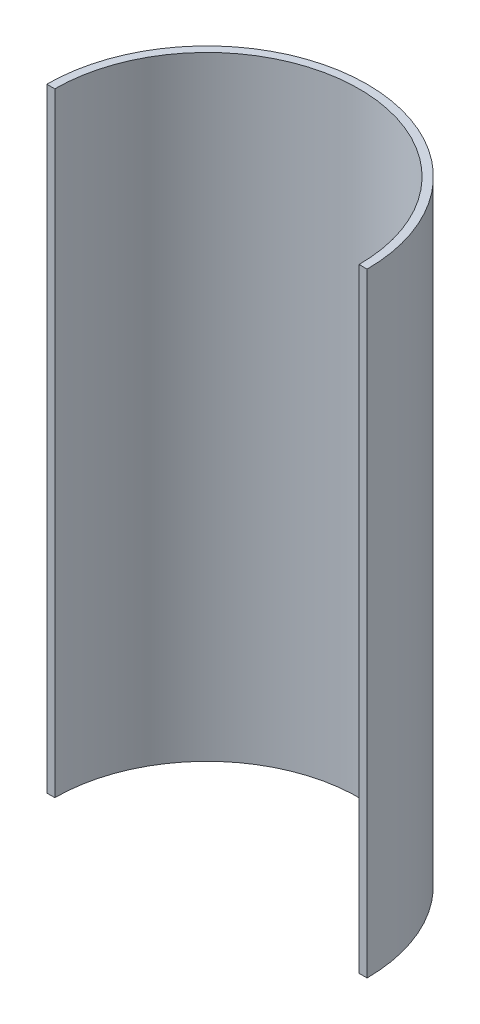
ISO-10303-21;
HEADER;
FILE_DESCRIPTION(('STEP AP214'),'2;1');
FILE_NAME('part.step','',(''),(''),'','','');
FILE_SCHEMA(('AUTOMOTIVE_DESIGN { 1 0 10303 214 1 1 1 1 }'));
ENDSEC;
DATA;
#1=APPLICATION_CONTEXT('core data for automotive mechanical design processes');
#2=APPLICATION_PROTOCOL_DEFINITION('international standard','automotive_design',2000,#1);
#3=PRODUCT_CONTEXT('',#1,'mechanical');
#4=PRODUCT('Part','Part','',(#3));
#5=PRODUCT_RELATED_PRODUCT_CATEGORY('part','',(#4));
#6=PRODUCT_DEFINITION_FORMATION('','',#4);
#7=PRODUCT_DEFINITION_CONTEXT('part definition',#1,'design');
#8=PRODUCT_DEFINITION('design','',#6,#7);
#9=PRODUCT_DEFINITION_SHAPE('','',#8);
#10=(LENGTH_UNIT() NAMED_UNIT(*) SI_UNIT(.MILLI.,.METRE.));
#11=(NAMED_UNIT(*) PLANE_ANGLE_UNIT() SI_UNIT($,.RADIAN.));
#12=(NAMED_UNIT(*) SI_UNIT($,.STERADIAN.) SOLID_ANGLE_UNIT());
#13=UNCERTAINTY_MEASURE_WITH_UNIT(LENGTH_MEASURE(1.E-05),#10,'distance_accuracy_value','');
#14=(GEOMETRIC_REPRESENTATION_CONTEXT(3) GLOBAL_UNCERTAINTY_ASSIGNED_CONTEXT((#13)) GLOBAL_UNIT_ASSIGNED_CONTEXT((#10,
#11,#12)) REPRESENTATION_CONTEXT('',''));
#15=CARTESIAN_POINT('',(0.,0.,0.));
#16=DIRECTION('',(0.,0.,1.));
#17=DIRECTION('',(1.,0.,0.));
#18=AXIS2_PLACEMENT_3D('',#15,#16,#17);
#19=CARTESIAN_POINT('',(0.,230.,0.));
#20=DIRECTION('',(0.,-1.,0.));
#21=DIRECTION('',(0.,0.,-1.));
#22=AXIS2_PLACEMENT_3D('',#19,#20,#21);
#23=CYLINDRICAL_SURFACE('',#22,57.);
#24=CARTESIAN_POINT('',(0.,0.,0.));
#25=DIRECTION('',(0.,-1.,0.));
#26=DIRECTION('',(0.,0.,1.));
#27=AXIS2_PLACEMENT_3D('',#24,#25,#26);
#28=CIRCLE('',#27,57.);
#29=CARTESIAN_POINT('',(-57.,0.,0.));
#30=VERTEX_POINT('',#29);
#31=CARTESIAN_POINT('',(57.,0.,0.));
#32=VERTEX_POINT('',#31);
#33=EDGE_CURVE('E96',#30,#32,#28,.T.);
#34=ORIENTED_EDGE('',*,*,#33,.T.);
#35=DIRECTION('',(0.,-1.,0.));
#36=VECTOR('',#35,1.);
#37=CARTESIAN_POINT('',(57.,230.,0.));
#38=LINE('',#37,#36);
#39=CARTESIAN_POINT('',(57.,230.,0.));
#40=VERTEX_POINT('',#39);
#41=EDGE_CURVE('E11',#40,#32,#38,.T.);
#42=ORIENTED_EDGE('',*,*,#41,.F.);
#43=CARTESIAN_POINT('',(0.,230.,0.));
#44=DIRECTION('',(0.,-1.,0.));
#45=DIRECTION('',(0.,0.,1.));
#46=AXIS2_PLACEMENT_3D('',#43,#44,#45);
#47=CIRCLE('',#46,57.);
#48=CARTESIAN_POINT('',(-57.,230.,0.));
#49=VERTEX_POINT('',#48);
#50=EDGE_CURVE('E84',#49,#40,#47,.T.);
#51=ORIENTED_EDGE('',*,*,#50,.F.);
#52=DIRECTION('',(0.,-1.,0.));
#53=VECTOR('',#52,1.);
#54=CARTESIAN_POINT('',(-57.,230.,0.));
#55=LINE('',#54,#53);
#56=EDGE_CURVE('E92',#49,#30,#55,.T.);
#57=ORIENTED_EDGE('',*,*,#56,.T.);
#58=EDGE_LOOP('',(#34,#42,#51,#57));
#59=FACE_BOUND('',#58,.T.);
#60=ADVANCED_FACE('F33',(#59),#23,.F.);
#61=CARTESIAN_POINT('',(57.,230.,0.));
#62=DIRECTION('',(0.,0.,-1.));
#63=DIRECTION('',(-1.,0.,0.));
#64=AXIS2_PLACEMENT_3D('',#61,#62,#63);
#65=PLANE('',#64);
#66=DIRECTION('',(1.,0.,0.));
#67=VECTOR('',#66,1.);
#68=CARTESIAN_POINT('',(57.,0.,0.));
#69=LINE('',#68,#67);
#70=CARTESIAN_POINT('',(60.,0.,0.));
#71=VERTEX_POINT('',#70);
#72=EDGE_CURVE('E88',#32,#71,#69,.T.);
#73=ORIENTED_EDGE('',*,*,#72,.T.);
#74=DIRECTION('',(0.,-1.,0.));
#75=VECTOR('',#74,1.);
#76=CARTESIAN_POINT('',(60.,230.,0.));
#77=LINE('',#76,#75);
#78=CARTESIAN_POINT('',(60.,230.,0.));
#79=VERTEX_POINT('',#78);
#80=EDGE_CURVE('E41',#79,#71,#77,.T.);
#81=ORIENTED_EDGE('',*,*,#80,.F.);
#82=DIRECTION('',(1.,0.,0.));
#83=VECTOR('',#82,1.);
#84=CARTESIAN_POINT('',(57.,230.,0.));
#85=LINE('',#84,#83);
#86=EDGE_CURVE('E79',#40,#79,#85,.T.);
#87=ORIENTED_EDGE('',*,*,#86,.F.);
#88=ORIENTED_EDGE('',*,*,#41,.T.);
#89=EDGE_LOOP('',(#73,#81,#87,#88));
#90=FACE_BOUND('',#89,.T.);
#91=ADVANCED_FACE('F87',(#90),#65,.F.);
#92=CARTESIAN_POINT('',(0.,230.,0.));
#93=DIRECTION('',(0.,-1.,0.));
#94=DIRECTION('',(0.,0.,-1.));
#95=AXIS2_PLACEMENT_3D('',#92,#93,#94);
#96=CYLINDRICAL_SURFACE('',#95,60.);
#97=CARTESIAN_POINT('',(0.,0.,0.));
#98=DIRECTION('',(0.,1.,0.));
#99=DIRECTION('',(0.,0.,1.));
#100=AXIS2_PLACEMENT_3D('',#97,#98,#99);
#101=CIRCLE('',#100,60.);
#102=CARTESIAN_POINT('',(-60.,0.,0.));
#103=VERTEX_POINT('',#102);
#104=EDGE_CURVE('E66',#71,#103,#101,.T.);
#105=ORIENTED_EDGE('',*,*,#104,.T.);
#106=DIRECTION('',(0.,-1.,0.));
#107=VECTOR('',#106,1.);
#108=CARTESIAN_POINT('',(-60.,230.,0.));
#109=LINE('',#108,#107);
#110=CARTESIAN_POINT('',(-60.,230.,0.));
#111=VERTEX_POINT('',#110);
#112=EDGE_CURVE('E89',#111,#103,#109,.T.);
#113=ORIENTED_EDGE('',*,*,#112,.F.);
#114=CARTESIAN_POINT('',(0.,230.,0.));
#115=DIRECTION('',(0.,1.,0.));
#116=DIRECTION('',(0.,0.,1.));
#117=AXIS2_PLACEMENT_3D('',#114,#115,#116);
#118=CIRCLE('',#117,60.);
#119=EDGE_CURVE('E82',#79,#111,#118,.T.);
#120=ORIENTED_EDGE('',*,*,#119,.F.);
#121=ORIENTED_EDGE('',*,*,#80,.T.);
#122=EDGE_LOOP('',(#105,#113,#120,#121));
#123=FACE_BOUND('',#122,.T.);
#124=ADVANCED_FACE('F90',(#123),#96,.T.);
#125=CARTESIAN_POINT('',(-60.,230.,0.));
#126=DIRECTION('',(0.,0.,-1.));
#127=DIRECTION('',(-1.,0.,0.));
#128=AXIS2_PLACEMENT_3D('',#125,#126,#127);
#129=PLANE('',#128);
#130=DIRECTION('',(1.,0.,0.));
#131=VECTOR('',#130,1.);
#132=CARTESIAN_POINT('',(-60.,0.,0.));
#133=LINE('',#132,#131);
#134=EDGE_CURVE('E72',#103,#30,#133,.T.);
#135=ORIENTED_EDGE('',*,*,#134,.T.);
#136=ORIENTED_EDGE('',*,*,#56,.F.);
#137=DIRECTION('',(1.,0.,0.));
#138=VECTOR('',#137,1.);
#139=CARTESIAN_POINT('',(-60.,230.,0.));
#140=LINE('',#139,#138);
#141=EDGE_CURVE('E49',#111,#49,#140,.T.);
#142=ORIENTED_EDGE('',*,*,#141,.F.);
#143=ORIENTED_EDGE('',*,*,#112,.T.);
#144=EDGE_LOOP('',(#135,#136,#142,#143));
#145=FACE_BOUND('',#144,.T.);
#146=ADVANCED_FACE('F103',(#145),#129,.F.);
#147=CARTESIAN_POINT('',(0.,230.,0.));
#148=DIRECTION('',(0.,1.,0.));
#149=DIRECTION('',(0.,0.,1.));
#150=AXIS2_PLACEMENT_3D('',#147,#148,#149);
#151=PLANE('',#150);
#152=ORIENTED_EDGE('',*,*,#50,.T.);
#153=ORIENTED_EDGE('',*,*,#86,.T.);
#154=ORIENTED_EDGE('',*,*,#119,.T.);
#155=ORIENTED_EDGE('',*,*,#141,.T.);
#156=EDGE_LOOP('',(#152,#153,#154,#155));
#157=FACE_BOUND('',#156,.T.);
#158=ADVANCED_FACE('F80',(#157),#151,.T.);
#159=CARTESIAN_POINT('',(0.,0.,0.));
#160=DIRECTION('',(0.,1.,0.));
#161=DIRECTION('',(0.,0.,1.));
#162=AXIS2_PLACEMENT_3D('',#159,#160,#161);
#163=PLANE('',#162);
#164=ORIENTED_EDGE('',*,*,#33,.F.);
#165=ORIENTED_EDGE('',*,*,#134,.F.);
#166=ORIENTED_EDGE('',*,*,#104,.F.);
#167=ORIENTED_EDGE('',*,*,#72,.F.);
#168=EDGE_LOOP('',(#164,#165,#166,#167));
#169=FACE_BOUND('',#168,.T.);
#170=ADVANCED_FACE('F106',(#169),#163,.F.);
#171=CLOSED_SHELL('',(#60,#91,#124,#146,#158,#170));
#172=MANIFOLD_SOLID_BREP('B2',#171);
#173=ADVANCED_BREP_SHAPE_REPRESENTATION('',(#18,#172),#14);
#174=SHAPE_DEFINITION_REPRESENTATION(#9,#173);
ENDSEC;
END-ISO-10303-21;
